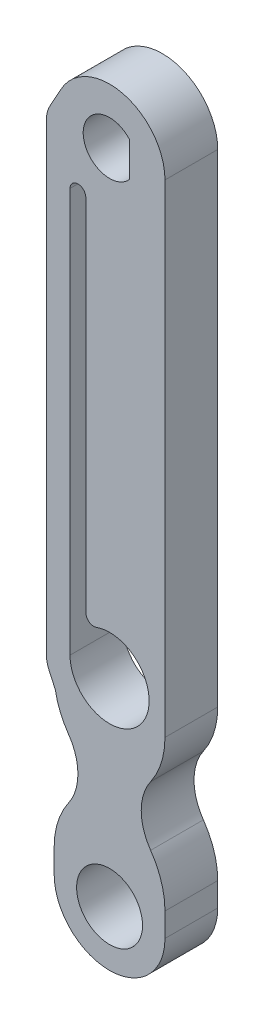
ISO-10303-21;
HEADER;
FILE_DESCRIPTION(('STEP AP214'),'2;1');
FILE_NAME('part.step','',(''),(''),'','','');
FILE_SCHEMA(('AUTOMOTIVE_DESIGN { 1 0 10303 214 1 1 1 1 }'));
ENDSEC;
DATA;
#1=APPLICATION_CONTEXT('core data for automotive mechanical design processes');
#2=APPLICATION_PROTOCOL_DEFINITION('international standard','automotive_design',2000,#1);
#3=PRODUCT_CONTEXT('',#1,'mechanical');
#4=PRODUCT('Part','Part','',(#3));
#5=PRODUCT_RELATED_PRODUCT_CATEGORY('part','',(#4));
#6=PRODUCT_DEFINITION_FORMATION('','',#4);
#7=PRODUCT_DEFINITION_CONTEXT('part definition',#1,'design');
#8=PRODUCT_DEFINITION('design','',#6,#7);
#9=PRODUCT_DEFINITION_SHAPE('','',#8);
#10=(LENGTH_UNIT() NAMED_UNIT(*) SI_UNIT(.MILLI.,.METRE.));
#11=(NAMED_UNIT(*) PLANE_ANGLE_UNIT() SI_UNIT($,.RADIAN.));
#12=(NAMED_UNIT(*) SI_UNIT($,.STERADIAN.) SOLID_ANGLE_UNIT());
#13=UNCERTAINTY_MEASURE_WITH_UNIT(LENGTH_MEASURE(1.E-05),#10,'distance_accuracy_value','');
#14=(GEOMETRIC_REPRESENTATION_CONTEXT(3) GLOBAL_UNCERTAINTY_ASSIGNED_CONTEXT((#13)) GLOBAL_UNIT_ASSIGNED_CONTEXT((#10,
#11,#12)) REPRESENTATION_CONTEXT('',''));
#15=CARTESIAN_POINT('',(0.,0.,0.));
#16=DIRECTION('',(0.,0.,1.));
#17=DIRECTION('',(1.,0.,0.));
#18=AXIS2_PLACEMENT_3D('',#15,#16,#17);
#19=CARTESIAN_POINT('',(0.,49.8,4.));
#20=DIRECTION('',(0.,0.,1.));
#21=DIRECTION('',(1.,0.,0.));
#22=AXIS2_PLACEMENT_3D('',#19,#20,#21);
#23=PLANE('',#22);
#24=CARTESIAN_POINT('',(0.,49.8,4.));
#25=DIRECTION('',(0.,0.,1.));
#26=DIRECTION('',(1.,0.,0.));
#27=AXIS2_PLACEMENT_3D('',#24,#25,#26);
#28=CIRCLE('',#27,4.20000000000001);
#29=CARTESIAN_POINT('',(4.19999999999998,49.8,4.));
#30=VERTEX_POINT('',#29);
#31=CARTESIAN_POINT('',(-3.70531896054092,51.7775265865865,4.));
#32=VERTEX_POINT('',#31);
#33=EDGE_CURVE('E257',#30,#32,#28,.T.);
#34=ORIENTED_EDGE('',*,*,#33,.T.);
#35=DIRECTION('',(-0.484308711135824,-0.874897178140356,0.));
#36=VECTOR('',#35,1.);
#37=CARTESIAN_POINT('',(-3.70531896054092,51.7775265865865,4.));
#38=LINE('',#37,#36);
#39=CARTESIAN_POINT('',(-4.49975322753685,50.3423917594992,4.));
#40=VERTEX_POINT('',#39);
#41=EDGE_CURVE('E260',#32,#40,#38,.T.);
#42=ORIENTED_EDGE('',*,*,#41,.T.);
#43=CARTESIAN_POINT('',(-2.40000000000001,49.1800508527732,4.));
#44=DIRECTION('',(0.,0.,1.));
#45=DIRECTION('',(1.,0.,0.));
#46=AXIS2_PLACEMENT_3D('',#43,#44,#45);
#47=CIRCLE('',#46,2.4);
#48=CARTESIAN_POINT('',(-4.80000000000001,49.1800508527732,4.));
#49=VERTEX_POINT('',#48);
#50=EDGE_CURVE('E263',#40,#49,#47,.T.);
#51=ORIENTED_EDGE('',*,*,#50,.T.);
#52=DIRECTION('',(0.,-1.,0.));
#53=VECTOR('',#52,1.);
#54=CARTESIAN_POINT('',(-4.80000000000001,49.1800508527732,4.));
#55=LINE('',#54,#53);
#56=CARTESIAN_POINT('',(-4.80000000000001,14.2024983221903,4.));
#57=VERTEX_POINT('',#56);
#58=EDGE_CURVE('E265',#49,#57,#55,.T.);
#59=ORIENTED_EDGE('',*,*,#58,.T.);
#60=CARTESIAN_POINT('',(-2.40000000000001,14.2024983221903,4.));
#61=DIRECTION('',(0.,0.,1.));
#62=DIRECTION('',(1.,0.,0.));
#63=AXIS2_PLACEMENT_3D('',#60,#61,#62);
#64=CIRCLE('',#63,2.4);
#65=CARTESIAN_POINT('',(-4.58181817947653,13.2026636199991,4.));
#66=VERTEX_POINT('',#65);
#67=EDGE_CURVE('E267',#57,#66,#64,.T.);
#68=ORIENTED_EDGE('',*,*,#67,.T.);
#69=DIRECTION('',(0.416597792579657,-0.909090908115221,0.));
#70=VECTOR('',#69,1.);
#71=CARTESIAN_POINT('',(-4.58181817947653,13.2026636199991,4.));
#72=LINE('',#71,#70);
#73=CARTESIAN_POINT('',(-4.11235575406724,12.1782126261554,4.));
#74=VERTEX_POINT('',#73);
#75=EDGE_CURVE('E269',#66,#74,#72,.T.);
#76=ORIENTED_EDGE('',*,*,#75,.T.);
#77=CARTESIAN_POINT('',(1.79999999999999,13.2,4.));
#78=DIRECTION('',(0.,0.,1.));
#79=DIRECTION('',(1.,0.,0.));
#80=AXIS2_PLACEMENT_3D('',#77,#78,#79);
#81=CIRCLE('',#80,6.00000000000001);
#82=CARTESIAN_POINT('',(-3.11183879093201,9.75415617128463,4.));
#83=VERTEX_POINT('',#82);
#84=EDGE_CURVE('E271',#74,#83,#81,.T.);
#85=ORIENTED_EDGE('',*,*,#84,.T.);
#86=CARTESIAN_POINT('',(-6.32500000000002,7.49999999999999,4.));
#87=DIRECTION('',(0.,0.,-1.));
#88=DIRECTION('',(1.,0.,0.));
#89=AXIS2_PLACEMENT_3D('',#86,#87,#88);
#90=CIRCLE('',#89,3.925);
#91=CARTESIAN_POINT('',(-3.11183879093201,5.24584382871536,4.));
#92=VERTEX_POINT('',#91);
#93=EDGE_CURVE('E273',#83,#92,#90,.T.);
#94=ORIENTED_EDGE('',*,*,#93,.T.);
#95=CARTESIAN_POINT('',(1.8,1.80000000000002,4.));
#96=DIRECTION('',(0.,0.,1.));
#97=DIRECTION('',(1.,0.,0.));
#98=AXIS2_PLACEMENT_3D('',#95,#96,#97);
#99=CIRCLE('',#98,6.00000000000001);
#100=CARTESIAN_POINT('',(-4.2,1.80000000000004,4.));
#101=VERTEX_POINT('',#100);
#102=EDGE_CURVE('E275',#92,#101,#99,.T.);
#103=ORIENTED_EDGE('',*,*,#102,.T.);
#104=DIRECTION('',(0.,-1.,0.));
#105=VECTOR('',#104,1.);
#106=CARTESIAN_POINT('',(-4.2,1.80000000000004,4.));
#107=LINE('',#106,#105);
#108=CARTESIAN_POINT('',(-4.2,0.,4.));
#109=VERTEX_POINT('',#108);
#110=EDGE_CURVE('E277',#101,#109,#107,.T.);
#111=ORIENTED_EDGE('',*,*,#110,.T.);
#112=CARTESIAN_POINT('',(0.,0.,4.));
#113=DIRECTION('',(0.,0.,1.));
#114=DIRECTION('',(1.,0.,0.));
#115=AXIS2_PLACEMENT_3D('',#112,#113,#114);
#116=CIRCLE('',#115,4.2);
#117=CARTESIAN_POINT('',(4.2,0.,4.));
#118=VERTEX_POINT('',#117);
#119=EDGE_CURVE('E279',#109,#118,#116,.T.);
#120=ORIENTED_EDGE('',*,*,#119,.T.);
#121=DIRECTION('',(0.,1.,0.));
#122=VECTOR('',#121,1.);
#123=CARTESIAN_POINT('',(4.2,0.,4.));
#124=LINE('',#123,#122);
#125=CARTESIAN_POINT('',(4.2,1.80000000000002,4.));
#126=VERTEX_POINT('',#125);
#127=EDGE_CURVE('E281',#118,#126,#124,.T.);
#128=ORIENTED_EDGE('',*,*,#127,.T.);
#129=CARTESIAN_POINT('',(-1.8,1.8,4.));
#130=DIRECTION('',(0.,0.,1.));
#131=DIRECTION('',(1.,0.,0.));
#132=AXIS2_PLACEMENT_3D('',#129,#130,#131);
#133=CIRCLE('',#132,6.00000000000001);
#134=CARTESIAN_POINT('',(3.111838790932,5.24584382871537,4.));
#135=VERTEX_POINT('',#134);
#136=EDGE_CURVE('E283',#126,#135,#133,.T.);
#137=ORIENTED_EDGE('',*,*,#136,.T.);
#138=CARTESIAN_POINT('',(6.32499999999999,7.50000000000002,4.));
#139=DIRECTION('',(0.,0.,-1.));
#140=DIRECTION('',(1.,0.,0.));
#141=AXIS2_PLACEMENT_3D('',#138,#139,#140);
#142=CIRCLE('',#141,3.925);
#143=CARTESIAN_POINT('',(3.11183879093197,9.75415617128464,4.));
#144=VERTEX_POINT('',#143);
#145=EDGE_CURVE('E285',#135,#144,#142,.T.);
#146=ORIENTED_EDGE('',*,*,#145,.T.);
#147=CARTESIAN_POINT('',(-1.80000000000003,13.2,4.));
#148=DIRECTION('',(0.,0.,1.));
#149=DIRECTION('',(1.,0.,0.));
#150=AXIS2_PLACEMENT_3D('',#147,#148,#149);
#151=CIRCLE('',#150,6.00000000000001);
#152=CARTESIAN_POINT('',(4.19999999999998,13.2,4.));
#153=VERTEX_POINT('',#152);
#154=EDGE_CURVE('E287',#144,#153,#151,.T.);
#155=ORIENTED_EDGE('',*,*,#154,.T.);
#156=DIRECTION('',(0.,1.,0.));
#157=VECTOR('',#156,1.);
#158=CARTESIAN_POINT('',(4.19999999999998,13.2,4.));
#159=LINE('',#158,#157);
#160=EDGE_CURVE('E289',#153,#30,#159,.T.);
#161=ORIENTED_EDGE('',*,*,#160,.T.);
#162=EDGE_LOOP('',(#34,#42,#51,#59,#68,#76,#85,#94,#103,#111,#120,#128,#137,#146,#155,#161));
#163=FACE_BOUND('',#162,.T.);
#164=CARTESIAN_POINT('',(0.,0.,4.));
#165=DIRECTION('',(0.,0.,1.));
#166=DIRECTION('',(1.,0.,0.));
#167=AXIS2_PLACEMENT_3D('',#164,#165,#166);
#168=CIRCLE('',#167,2.5);
#169=CARTESIAN_POINT('',(2.5,0.,4.));
#170=VERTEX_POINT('',#169);
#171=EDGE_CURVE('E251',#170,#170,#168,.T.);
#172=ORIENTED_EDGE('',*,*,#171,.F.);
#173=EDGE_LOOP('',(#172));
#174=FACE_BOUND('',#173,.T.);
#175=DIRECTION('',(0.,1.,0.));
#176=VECTOR('',#175,1.);
#177=CARTESIAN_POINT('',(1.49999999999999,48.4771243444677,4.));
#178=LINE('',#177,#176);
#179=CARTESIAN_POINT('',(1.49999999999999,48.4771243444677,4.));
#180=VERTEX_POINT('',#179);
#181=CARTESIAN_POINT('',(1.5,51.1228756555323,4.));
#182=VERTEX_POINT('',#181);
#183=EDGE_CURVE('E237',#180,#182,#178,.T.);
#184=ORIENTED_EDGE('',*,*,#183,.F.);
#185=CARTESIAN_POINT('',(0.,49.8,4.));
#186=DIRECTION('',(0.,0.,1.));
#187=DIRECTION('',(1.,0.,0.));
#188=AXIS2_PLACEMENT_3D('',#185,#186,#187);
#189=CIRCLE('',#188,2.);
#190=EDGE_CURVE('E234',#182,#180,#189,.T.);
#191=ORIENTED_EDGE('',*,*,#190,.F.);
#192=EDGE_LOOP('',(#184,#191));
#193=FACE_BOUND('',#192,.T.);
#194=CARTESIAN_POINT('',(-1.20000000000001,18.3941125496954,4.));
#195=DIRECTION('',(0.,0.,-1.));
#196=DIRECTION('',(1.,0.,0.));
#197=AXIS2_PLACEMENT_3D('',#194,#195,#196);
#198=CIRCLE('',#197,0.599999999999997);
#199=CARTESIAN_POINT('',(-0.99999999999999,17.8284271247462,4.));
#200=VERTEX_POINT('',#199);
#201=CARTESIAN_POINT('',(-1.80000000000001,18.3941125496955,4.));
#202=VERTEX_POINT('',#201);
#203=EDGE_CURVE('E198',#200,#202,#198,.T.);
#204=ORIENTED_EDGE('',*,*,#203,.F.);
#205=CARTESIAN_POINT('',(0.,15.,4.));
#206=DIRECTION('',(0.,0.,1.));
#207=DIRECTION('',(1.,0.,0.));
#208=AXIS2_PLACEMENT_3D('',#205,#206,#207);
#209=CIRCLE('',#208,3.00000000000001);
#210=CARTESIAN_POINT('',(-3.00000000000001,15.,4.));
#211=VERTEX_POINT('',#210);
#212=EDGE_CURVE('E190',#211,#200,#209,.T.);
#213=ORIENTED_EDGE('',*,*,#212,.F.);
#214=DIRECTION('',(0.,-1.,0.));
#215=VECTOR('',#214,1.);
#216=CARTESIAN_POINT('',(-3.00000000000001,45.6430780618347,4.));
#217=LINE('',#216,#215);
#218=CARTESIAN_POINT('',(-3.00000000000001,45.6430780618347,4.));
#219=VERTEX_POINT('',#218);
#220=EDGE_CURVE('E217',#219,#211,#217,.T.);
#221=ORIENTED_EDGE('',*,*,#220,.F.);
#222=CARTESIAN_POINT('',(-2.40000000000001,45.6430780618347,4.));
#223=DIRECTION('',(0.,0.,1.));
#224=DIRECTION('',(1.,0.,0.));
#225=AXIS2_PLACEMENT_3D('',#222,#223,#224);
#226=CIRCLE('',#225,0.600000000000001);
#227=CARTESIAN_POINT('',(-1.80000000000001,45.6430780618347,4.));
#228=VERTEX_POINT('',#227);
#229=EDGE_CURVE('E213',#228,#219,#226,.T.);
#230=ORIENTED_EDGE('',*,*,#229,.F.);
#231=DIRECTION('',(0.,1.,0.));
#232=VECTOR('',#231,1.);
#233=CARTESIAN_POINT('',(-1.80000000000001,18.3941125496955,4.));
#234=LINE('',#233,#232);
#235=EDGE_CURVE('E211',#202,#228,#234,.T.);
#236=ORIENTED_EDGE('',*,*,#235,.F.);
#237=EDGE_LOOP('',(#204,#213,#221,#230,#236));
#238=FACE_BOUND('',#237,.T.);
#239=ADVANCED_FACE('F35',(#163,#174,#193,#238),#23,.T.);
#240=CARTESIAN_POINT('',(0.,49.8,0.));
#241=DIRECTION('',(0.,0.,1.));
#242=DIRECTION('',(1.,0.,0.));
#243=AXIS2_PLACEMENT_3D('',#240,#241,#242);
#244=PLANE('',#243);
#245=CARTESIAN_POINT('',(0.,49.8,0.));
#246=DIRECTION('',(0.,0.,1.));
#247=DIRECTION('',(1.,0.,0.));
#248=AXIS2_PLACEMENT_3D('',#245,#246,#247);
#249=CIRCLE('',#248,2.);
#250=CARTESIAN_POINT('',(1.5,51.1228756555323,0.));
#251=VERTEX_POINT('',#250);
#252=CARTESIAN_POINT('',(1.49999999999999,48.4771243444677,0.));
#253=VERTEX_POINT('',#252);
#254=EDGE_CURVE('E206',#251,#253,#249,.T.);
#255=ORIENTED_EDGE('',*,*,#254,.T.);
#256=DIRECTION('',(0.,1.,0.));
#257=VECTOR('',#256,1.);
#258=CARTESIAN_POINT('',(1.49999999999999,48.4771243444677,0.));
#259=LINE('',#258,#257);
#260=EDGE_CURVE('E238',#253,#251,#259,.T.);
#261=ORIENTED_EDGE('',*,*,#260,.T.);
#262=EDGE_LOOP('',(#255,#261));
#263=FACE_BOUND('',#262,.T.);
#264=CARTESIAN_POINT('',(0.,49.8,0.));
#265=DIRECTION('',(0.,0.,1.));
#266=DIRECTION('',(1.,0.,0.));
#267=AXIS2_PLACEMENT_3D('',#264,#265,#266);
#268=CIRCLE('',#267,4.20000000000001);
#269=CARTESIAN_POINT('',(4.19999999999998,49.8,0.));
#270=VERTEX_POINT('',#269);
#271=CARTESIAN_POINT('',(-3.70531896054092,51.7775265865865,0.));
#272=VERTEX_POINT('',#271);
#273=EDGE_CURVE('E254',#270,#272,#268,.T.);
#274=ORIENTED_EDGE('',*,*,#273,.F.);
#275=DIRECTION('',(0.,1.,0.));
#276=VECTOR('',#275,1.);
#277=CARTESIAN_POINT('',(4.19999999999998,13.2,0.));
#278=LINE('',#277,#276);
#279=CARTESIAN_POINT('',(4.19999999999998,13.2,0.));
#280=VERTEX_POINT('',#279);
#281=EDGE_CURVE('E261',#280,#270,#278,.T.);
#282=ORIENTED_EDGE('',*,*,#281,.F.);
#283=CARTESIAN_POINT('',(-1.80000000000003,13.2,0.));
#284=DIRECTION('',(0.,0.,1.));
#285=DIRECTION('',(1.,0.,0.));
#286=AXIS2_PLACEMENT_3D('',#283,#284,#285);
#287=CIRCLE('',#286,6.00000000000001);
#288=CARTESIAN_POINT('',(3.11183879093197,9.75415617128464,0.));
#289=VERTEX_POINT('',#288);
#290=EDGE_CURVE('E320',#289,#280,#287,.T.);
#291=ORIENTED_EDGE('',*,*,#290,.F.);
#292=CARTESIAN_POINT('',(6.32499999999999,7.50000000000002,0.));
#293=DIRECTION('',(0.,0.,-1.));
#294=DIRECTION('',(1.,0.,0.));
#295=AXIS2_PLACEMENT_3D('',#292,#293,#294);
#296=CIRCLE('',#295,3.925);
#297=CARTESIAN_POINT('',(3.111838790932,5.24584382871537,0.));
#298=VERTEX_POINT('',#297);
#299=EDGE_CURVE('E318',#298,#289,#296,.T.);
#300=ORIENTED_EDGE('',*,*,#299,.F.);
#301=CARTESIAN_POINT('',(-1.8,1.8,0.));
#302=DIRECTION('',(0.,0.,1.));
#303=DIRECTION('',(1.,0.,0.));
#304=AXIS2_PLACEMENT_3D('',#301,#302,#303);
#305=CIRCLE('',#304,6.00000000000001);
#306=CARTESIAN_POINT('',(4.2,1.80000000000002,0.));
#307=VERTEX_POINT('',#306);
#308=EDGE_CURVE('E316',#307,#298,#305,.T.);
#309=ORIENTED_EDGE('',*,*,#308,.F.);
#310=DIRECTION('',(0.,1.,0.));
#311=VECTOR('',#310,1.);
#312=CARTESIAN_POINT('',(4.2,0.,0.));
#313=LINE('',#312,#311);
#314=CARTESIAN_POINT('',(4.2,0.,0.));
#315=VERTEX_POINT('',#314);
#316=EDGE_CURVE('E314',#315,#307,#313,.T.);
#317=ORIENTED_EDGE('',*,*,#316,.F.);
#318=CARTESIAN_POINT('',(0.,0.,0.));
#319=DIRECTION('',(0.,0.,1.));
#320=DIRECTION('',(1.,0.,0.));
#321=AXIS2_PLACEMENT_3D('',#318,#319,#320);
#322=CIRCLE('',#321,4.2);
#323=CARTESIAN_POINT('',(-4.2,0.,0.));
#324=VERTEX_POINT('',#323);
#325=EDGE_CURVE('E312',#324,#315,#322,.T.);
#326=ORIENTED_EDGE('',*,*,#325,.F.);
#327=DIRECTION('',(0.,-1.,0.));
#328=VECTOR('',#327,1.);
#329=CARTESIAN_POINT('',(-4.2,1.80000000000004,0.));
#330=LINE('',#329,#328);
#331=CARTESIAN_POINT('',(-4.2,1.80000000000004,0.));
#332=VERTEX_POINT('',#331);
#333=EDGE_CURVE('E310',#332,#324,#330,.T.);
#334=ORIENTED_EDGE('',*,*,#333,.F.);
#335=CARTESIAN_POINT('',(1.8,1.80000000000002,0.));
#336=DIRECTION('',(0.,0.,1.));
#337=DIRECTION('',(1.,0.,0.));
#338=AXIS2_PLACEMENT_3D('',#335,#336,#337);
#339=CIRCLE('',#338,6.00000000000001);
#340=CARTESIAN_POINT('',(-3.11183879093201,5.24584382871536,0.));
#341=VERTEX_POINT('',#340);
#342=EDGE_CURVE('E308',#341,#332,#339,.T.);
#343=ORIENTED_EDGE('',*,*,#342,.F.);
#344=CARTESIAN_POINT('',(-6.32500000000002,7.49999999999999,0.));
#345=DIRECTION('',(0.,0.,-1.));
#346=DIRECTION('',(1.,0.,0.));
#347=AXIS2_PLACEMENT_3D('',#344,#345,#346);
#348=CIRCLE('',#347,3.925);
#349=CARTESIAN_POINT('',(-3.11183879093201,9.75415617128463,0.));
#350=VERTEX_POINT('',#349);
#351=EDGE_CURVE('E306',#350,#341,#348,.T.);
#352=ORIENTED_EDGE('',*,*,#351,.F.);
#353=CARTESIAN_POINT('',(1.79999999999999,13.2,0.));
#354=DIRECTION('',(0.,0.,1.));
#355=DIRECTION('',(1.,0.,0.));
#356=AXIS2_PLACEMENT_3D('',#353,#354,#355);
#357=CIRCLE('',#356,6.00000000000001);
#358=CARTESIAN_POINT('',(-4.11235575406724,12.1782126261554,0.));
#359=VERTEX_POINT('',#358);
#360=EDGE_CURVE('E304',#359,#350,#357,.T.);
#361=ORIENTED_EDGE('',*,*,#360,.F.);
#362=DIRECTION('',(0.416597792579657,-0.909090908115221,0.));
#363=VECTOR('',#362,1.);
#364=CARTESIAN_POINT('',(-4.58181817947653,13.2026636199991,0.));
#365=LINE('',#364,#363);
#366=CARTESIAN_POINT('',(-4.58181817947653,13.2026636199991,0.));
#367=VERTEX_POINT('',#366);
#368=EDGE_CURVE('E302',#367,#359,#365,.T.);
#369=ORIENTED_EDGE('',*,*,#368,.F.);
#370=CARTESIAN_POINT('',(-2.40000000000001,14.2024983221903,0.));
#371=DIRECTION('',(0.,0.,1.));
#372=DIRECTION('',(1.,0.,0.));
#373=AXIS2_PLACEMENT_3D('',#370,#371,#372);
#374=CIRCLE('',#373,2.4);
#375=CARTESIAN_POINT('',(-4.80000000000001,14.2024983221903,0.));
#376=VERTEX_POINT('',#375);
#377=EDGE_CURVE('E300',#376,#367,#374,.T.);
#378=ORIENTED_EDGE('',*,*,#377,.F.);
#379=DIRECTION('',(0.,-1.,0.));
#380=VECTOR('',#379,1.);
#381=CARTESIAN_POINT('',(-4.80000000000001,49.1800508527732,0.));
#382=LINE('',#381,#380);
#383=CARTESIAN_POINT('',(-4.80000000000001,49.1800508527732,0.));
#384=VERTEX_POINT('',#383);
#385=EDGE_CURVE('E298',#384,#376,#382,.T.);
#386=ORIENTED_EDGE('',*,*,#385,.F.);
#387=CARTESIAN_POINT('',(-2.40000000000001,49.1800508527732,0.));
#388=DIRECTION('',(0.,0.,1.));
#389=DIRECTION('',(1.,0.,0.));
#390=AXIS2_PLACEMENT_3D('',#387,#388,#389);
#391=CIRCLE('',#390,2.4);
#392=CARTESIAN_POINT('',(-4.49975322753685,50.3423917594992,0.));
#393=VERTEX_POINT('',#392);
#394=EDGE_CURVE('E296',#393,#384,#391,.T.);
#395=ORIENTED_EDGE('',*,*,#394,.F.);
#396=DIRECTION('',(-0.484308711135824,-0.874897178140356,0.));
#397=VECTOR('',#396,1.);
#398=CARTESIAN_POINT('',(-3.70531896054092,51.7775265865865,0.));
#399=LINE('',#398,#397);
#400=EDGE_CURVE('E294',#272,#393,#399,.T.);
#401=ORIENTED_EDGE('',*,*,#400,.F.);
#402=EDGE_LOOP('',(#274,#282,#291,#300,#309,#317,#326,#334,#343,#352,#361,#369,#378,#386,#395,#401));
#403=FACE_BOUND('',#402,.T.);
#404=CARTESIAN_POINT('',(0.,0.,0.));
#405=DIRECTION('',(0.,0.,1.));
#406=DIRECTION('',(1.,0.,0.));
#407=AXIS2_PLACEMENT_3D('',#404,#405,#406);
#408=CIRCLE('',#407,2.5);
#409=CARTESIAN_POINT('',(2.5,0.,0.));
#410=VERTEX_POINT('',#409);
#411=EDGE_CURVE('E250',#410,#410,#408,.T.);
#412=ORIENTED_EDGE('',*,*,#411,.T.);
#413=EDGE_LOOP('',(#412));
#414=FACE_BOUND('',#413,.T.);
#415=CARTESIAN_POINT('',(0.,15.,0.));
#416=DIRECTION('',(0.,0.,1.));
#417=DIRECTION('',(1.,0.,0.));
#418=AXIS2_PLACEMENT_3D('',#415,#416,#417);
#419=CIRCLE('',#418,3.00000000000001);
#420=CARTESIAN_POINT('',(-3.00000000000001,15.,0.));
#421=VERTEX_POINT('',#420);
#422=CARTESIAN_POINT('',(-0.99999999999999,17.8284271247462,0.));
#423=VERTEX_POINT('',#422);
#424=EDGE_CURVE('E58',#421,#423,#419,.T.);
#425=ORIENTED_EDGE('',*,*,#424,.T.);
#426=CARTESIAN_POINT('',(-1.20000000000001,18.3941125496954,0.));
#427=DIRECTION('',(0.,0.,-1.));
#428=DIRECTION('',(1.,0.,0.));
#429=AXIS2_PLACEMENT_3D('',#426,#427,#428);
#430=CIRCLE('',#429,0.599999999999997);
#431=CARTESIAN_POINT('',(-1.80000000000001,18.3941125496955,0.));
#432=VERTEX_POINT('',#431);
#433=EDGE_CURVE('E205',#423,#432,#430,.T.);
#434=ORIENTED_EDGE('',*,*,#433,.T.);
#435=DIRECTION('',(0.,1.,0.));
#436=VECTOR('',#435,1.);
#437=CARTESIAN_POINT('',(-1.80000000000001,18.3941125496955,0.));
#438=LINE('',#437,#436);
#439=CARTESIAN_POINT('',(-1.80000000000001,45.6430780618347,0.));
#440=VERTEX_POINT('',#439);
#441=EDGE_CURVE('E221',#432,#440,#438,.T.);
#442=ORIENTED_EDGE('',*,*,#441,.T.);
#443=CARTESIAN_POINT('',(-2.40000000000001,45.6430780618347,0.));
#444=DIRECTION('',(0.,0.,1.));
#445=DIRECTION('',(1.,0.,0.));
#446=AXIS2_PLACEMENT_3D('',#443,#444,#445);
#447=CIRCLE('',#446,0.600000000000001);
#448=CARTESIAN_POINT('',(-3.00000000000001,45.6430780618347,0.));
#449=VERTEX_POINT('',#448);
#450=EDGE_CURVE('E224',#440,#449,#447,.T.);
#451=ORIENTED_EDGE('',*,*,#450,.T.);
#452=DIRECTION('',(0.,-1.,0.));
#453=VECTOR('',#452,1.);
#454=CARTESIAN_POINT('',(-3.00000000000001,45.6430780618347,0.));
#455=LINE('',#454,#453);
#456=EDGE_CURVE('E199',#449,#421,#455,.T.);
#457=ORIENTED_EDGE('',*,*,#456,.T.);
#458=EDGE_LOOP('',(#425,#434,#442,#451,#457));
#459=FACE_BOUND('',#458,.T.);
#460=ADVANCED_FACE('F374',(#263,#403,#414,#459),#244,.F.);
#461=CARTESIAN_POINT('',(0.,49.8,4.));
#462=DIRECTION('',(0.,0.,-1.));
#463=DIRECTION('',(-1.,0.,0.));
#464=AXIS2_PLACEMENT_3D('',#461,#462,#463);
#465=CYLINDRICAL_SURFACE('',#464,4.20000000000001);
#466=ORIENTED_EDGE('',*,*,#273,.T.);
#467=DIRECTION('',(0.,0.,-1.));
#468=VECTOR('',#467,1.);
#469=CARTESIAN_POINT('',(-3.70531896054092,51.7775265865865,4.));
#470=LINE('',#469,#468);
#471=EDGE_CURVE('E11',#32,#272,#470,.T.);
#472=ORIENTED_EDGE('',*,*,#471,.F.);
#473=ORIENTED_EDGE('',*,*,#33,.F.);
#474=DIRECTION('',(0.,0.,-1.));
#475=VECTOR('',#474,1.);
#476=CARTESIAN_POINT('',(4.19999999999998,49.8,4.));
#477=LINE('',#476,#475);
#478=EDGE_CURVE('E291',#30,#270,#477,.T.);
#479=ORIENTED_EDGE('',*,*,#478,.T.);
#480=EDGE_LOOP('',(#466,#472,#473,#479));
#481=FACE_BOUND('',#480,.T.);
#482=ADVANCED_FACE('F37',(#481),#465,.T.);
#483=CARTESIAN_POINT('',(-3.70531896054092,51.7775265865865,4.));
#484=DIRECTION('',(0.874897178140356,-0.484308711135824,0.));
#485=DIRECTION('',(0.484308711135824,0.874897178140356,0.));
#486=AXIS2_PLACEMENT_3D('',#483,#484,#485);
#487=PLANE('',#486);
#488=ORIENTED_EDGE('',*,*,#400,.T.);
#489=DIRECTION('',(0.,0.,-1.));
#490=VECTOR('',#489,1.);
#491=CARTESIAN_POINT('',(-4.49975322753685,50.3423917594992,4.));
#492=LINE('',#491,#490);
#493=EDGE_CURVE('E43',#40,#393,#492,.T.);
#494=ORIENTED_EDGE('',*,*,#493,.F.);
#495=ORIENTED_EDGE('',*,*,#41,.F.);
#496=ORIENTED_EDGE('',*,*,#471,.T.);
#497=EDGE_LOOP('',(#488,#494,#495,#496));
#498=FACE_BOUND('',#497,.T.);
#499=ADVANCED_FACE('F392',(#498),#487,.F.);
#500=CARTESIAN_POINT('',(-2.40000000000001,49.1800508527732,4.));
#501=DIRECTION('',(0.,0.,-1.));
#502=DIRECTION('',(-1.,0.,0.));
#503=AXIS2_PLACEMENT_3D('',#500,#501,#502);
#504=CYLINDRICAL_SURFACE('',#503,2.4);
#505=ORIENTED_EDGE('',*,*,#394,.T.);
#506=DIRECTION('',(0.,0.,-1.));
#507=VECTOR('',#506,1.);
#508=CARTESIAN_POINT('',(-4.80000000000001,49.1800508527732,4.));
#509=LINE('',#508,#507);
#510=EDGE_CURVE('E361',#49,#384,#509,.T.);
#511=ORIENTED_EDGE('',*,*,#510,.F.);
#512=ORIENTED_EDGE('',*,*,#50,.F.);
#513=ORIENTED_EDGE('',*,*,#493,.T.);
#514=EDGE_LOOP('',(#505,#511,#512,#513));
#515=FACE_BOUND('',#514,.T.);
#516=ADVANCED_FACE('F368',(#515),#504,.T.);
#517=CARTESIAN_POINT('',(-4.80000000000001,49.1800508527732,4.));
#518=DIRECTION('',(1.,0.,0.));
#519=DIRECTION('',(0.,0.,-1.));
#520=AXIS2_PLACEMENT_3D('',#517,#518,#519);
#521=PLANE('',#520);
#522=ORIENTED_EDGE('',*,*,#385,.T.);
#523=DIRECTION('',(0.,0.,-1.));
#524=VECTOR('',#523,1.);
#525=CARTESIAN_POINT('',(-4.80000000000001,14.2024983221903,4.));
#526=LINE('',#525,#524);
#527=EDGE_CURVE('E358',#57,#376,#526,.T.);
#528=ORIENTED_EDGE('',*,*,#527,.F.);
#529=ORIENTED_EDGE('',*,*,#58,.F.);
#530=ORIENTED_EDGE('',*,*,#510,.T.);
#531=EDGE_LOOP('',(#522,#528,#529,#530));
#532=FACE_BOUND('',#531,.T.);
#533=ADVANCED_FACE('F380',(#532),#521,.F.);
#534=CARTESIAN_POINT('',(-2.40000000000001,14.2024983221903,4.));
#535=DIRECTION('',(0.,0.,-1.));
#536=DIRECTION('',(-1.,0.,0.));
#537=AXIS2_PLACEMENT_3D('',#534,#535,#536);
#538=CYLINDRICAL_SURFACE('',#537,2.4);
#539=ORIENTED_EDGE('',*,*,#377,.T.);
#540=DIRECTION('',(0.,0.,-1.));
#541=VECTOR('',#540,1.);
#542=CARTESIAN_POINT('',(-4.58181817947653,13.2026636199991,4.));
#543=LINE('',#542,#541);
#544=EDGE_CURVE('E355',#66,#367,#543,.T.);
#545=ORIENTED_EDGE('',*,*,#544,.F.);
#546=ORIENTED_EDGE('',*,*,#67,.F.);
#547=ORIENTED_EDGE('',*,*,#527,.T.);
#548=EDGE_LOOP('',(#539,#545,#546,#547));
#549=FACE_BOUND('',#548,.T.);
#550=ADVANCED_FACE('F384',(#549),#538,.T.);
#551=CARTESIAN_POINT('',(-4.58181817947653,13.2026636199991,4.));
#552=DIRECTION('',(0.909090908115221,0.416597792579657,0.));
#553=DIRECTION('',(-0.416597792579657,0.909090908115221,0.));
#554=AXIS2_PLACEMENT_3D('',#551,#552,#553);
#555=PLANE('',#554);
#556=ORIENTED_EDGE('',*,*,#368,.T.);
#557=DIRECTION('',(0.,0.,-1.));
#558=VECTOR('',#557,1.);
#559=CARTESIAN_POINT('',(-4.11235575406724,12.1782126261554,4.));
#560=LINE('',#559,#558);
#561=EDGE_CURVE('E352',#74,#359,#560,.T.);
#562=ORIENTED_EDGE('',*,*,#561,.F.);
#563=ORIENTED_EDGE('',*,*,#75,.F.);
#564=ORIENTED_EDGE('',*,*,#544,.T.);
#565=EDGE_LOOP('',(#556,#562,#563,#564));
#566=FACE_BOUND('',#565,.T.);
#567=ADVANCED_FACE('F445',(#566),#555,.F.);
#568=CARTESIAN_POINT('',(1.79999999999999,13.2,4.));
#569=DIRECTION('',(0.,0.,-1.));
#570=DIRECTION('',(-1.,0.,0.));
#571=AXIS2_PLACEMENT_3D('',#568,#569,#570);
#572=CYLINDRICAL_SURFACE('',#571,6.00000000000001);
#573=ORIENTED_EDGE('',*,*,#360,.T.);
#574=DIRECTION('',(0.,0.,-1.));
#575=VECTOR('',#574,1.);
#576=CARTESIAN_POINT('',(-3.11183879093201,9.75415617128463,4.));
#577=LINE('',#576,#575);
#578=EDGE_CURVE('E349',#83,#350,#577,.T.);
#579=ORIENTED_EDGE('',*,*,#578,.F.);
#580=ORIENTED_EDGE('',*,*,#84,.F.);
#581=ORIENTED_EDGE('',*,*,#561,.T.);
#582=EDGE_LOOP('',(#573,#579,#580,#581));
#583=FACE_BOUND('',#582,.T.);
#584=ADVANCED_FACE('F442',(#583),#572,.T.);
#585=CARTESIAN_POINT('',(-6.32500000000002,7.49999999999999,4.));
#586=DIRECTION('',(0.,0.,-1.));
#587=DIRECTION('',(-1.,0.,0.));
#588=AXIS2_PLACEMENT_3D('',#585,#586,#587);
#589=CYLINDRICAL_SURFACE('',#588,3.925);
#590=ORIENTED_EDGE('',*,*,#351,.T.);
#591=DIRECTION('',(0.,0.,-1.));
#592=VECTOR('',#591,1.);
#593=CARTESIAN_POINT('',(-3.11183879093201,5.24584382871536,4.));
#594=LINE('',#593,#592);
#595=EDGE_CURVE('E346',#92,#341,#594,.T.);
#596=ORIENTED_EDGE('',*,*,#595,.F.);
#597=ORIENTED_EDGE('',*,*,#93,.F.);
#598=ORIENTED_EDGE('',*,*,#578,.T.);
#599=EDGE_LOOP('',(#590,#596,#597,#598));
#600=FACE_BOUND('',#599,.T.);
#601=ADVANCED_FACE('F438',(#600),#589,.F.);
#602=CARTESIAN_POINT('',(1.8,1.80000000000002,4.));
#603=DIRECTION('',(0.,0.,-1.));
#604=DIRECTION('',(-1.,0.,0.));
#605=AXIS2_PLACEMENT_3D('',#602,#603,#604);
#606=CYLINDRICAL_SURFACE('',#605,6.00000000000001);
#607=ORIENTED_EDGE('',*,*,#342,.T.);
#608=DIRECTION('',(0.,0.,-1.));
#609=VECTOR('',#608,1.);
#610=CARTESIAN_POINT('',(-4.2,1.80000000000004,4.));
#611=LINE('',#610,#609);
#612=EDGE_CURVE('E343',#101,#332,#611,.T.);
#613=ORIENTED_EDGE('',*,*,#612,.F.);
#614=ORIENTED_EDGE('',*,*,#102,.F.);
#615=ORIENTED_EDGE('',*,*,#595,.T.);
#616=EDGE_LOOP('',(#607,#613,#614,#615));
#617=FACE_BOUND('',#616,.T.);
#618=ADVANCED_FACE('F434',(#617),#606,.T.);
#619=CARTESIAN_POINT('',(-4.2,1.80000000000004,4.));
#620=DIRECTION('',(1.,0.,0.));
#621=DIRECTION('',(0.,0.,-1.));
#622=AXIS2_PLACEMENT_3D('',#619,#620,#621);
#623=PLANE('',#622);
#624=ORIENTED_EDGE('',*,*,#333,.T.);
#625=DIRECTION('',(0.,0.,-1.));
#626=VECTOR('',#625,1.);
#627=CARTESIAN_POINT('',(-4.2,0.,4.));
#628=LINE('',#627,#626);
#629=EDGE_CURVE('E340',#109,#324,#628,.T.);
#630=ORIENTED_EDGE('',*,*,#629,.F.);
#631=ORIENTED_EDGE('',*,*,#110,.F.);
#632=ORIENTED_EDGE('',*,*,#612,.T.);
#633=EDGE_LOOP('',(#624,#630,#631,#632));
#634=FACE_BOUND('',#633,.T.);
#635=ADVANCED_FACE('F429',(#634),#623,.F.);
#636=CARTESIAN_POINT('',(0.,0.,4.));
#637=DIRECTION('',(0.,0.,-1.));
#638=DIRECTION('',(-1.,0.,0.));
#639=AXIS2_PLACEMENT_3D('',#636,#637,#638);
#640=CYLINDRICAL_SURFACE('',#639,4.2);
#641=ORIENTED_EDGE('',*,*,#325,.T.);
#642=DIRECTION('',(0.,0.,-1.));
#643=VECTOR('',#642,1.);
#644=CARTESIAN_POINT('',(4.2,0.,4.));
#645=LINE('',#644,#643);
#646=EDGE_CURVE('E337',#118,#315,#645,.T.);
#647=ORIENTED_EDGE('',*,*,#646,.F.);
#648=ORIENTED_EDGE('',*,*,#119,.F.);
#649=ORIENTED_EDGE('',*,*,#629,.T.);
#650=EDGE_LOOP('',(#641,#647,#648,#649));
#651=FACE_BOUND('',#650,.T.);
#652=ADVANCED_FACE('F423',(#651),#640,.T.);
#653=CARTESIAN_POINT('',(4.2,0.,4.));
#654=DIRECTION('',(-1.,0.,0.));
#655=DIRECTION('',(0.,0.,1.));
#656=AXIS2_PLACEMENT_3D('',#653,#654,#655);
#657=PLANE('',#656);
#658=ORIENTED_EDGE('',*,*,#316,.T.);
#659=DIRECTION('',(0.,0.,-1.));
#660=VECTOR('',#659,1.);
#661=CARTESIAN_POINT('',(4.2,1.80000000000002,4.));
#662=LINE('',#661,#660);
#663=EDGE_CURVE('E334',#126,#307,#662,.T.);
#664=ORIENTED_EDGE('',*,*,#663,.F.);
#665=ORIENTED_EDGE('',*,*,#127,.F.);
#666=ORIENTED_EDGE('',*,*,#646,.T.);
#667=EDGE_LOOP('',(#658,#664,#665,#666));
#668=FACE_BOUND('',#667,.T.);
#669=ADVANCED_FACE('F419',(#668),#657,.F.);
#670=CARTESIAN_POINT('',(-1.8,1.8,4.));
#671=DIRECTION('',(0.,0.,-1.));
#672=DIRECTION('',(-1.,0.,0.));
#673=AXIS2_PLACEMENT_3D('',#670,#671,#672);
#674=CYLINDRICAL_SURFACE('',#673,6.00000000000001);
#675=ORIENTED_EDGE('',*,*,#308,.T.);
#676=DIRECTION('',(0.,0.,-1.));
#677=VECTOR('',#676,1.);
#678=CARTESIAN_POINT('',(3.111838790932,5.24584382871537,4.));
#679=LINE('',#678,#677);
#680=EDGE_CURVE('E331',#135,#298,#679,.T.);
#681=ORIENTED_EDGE('',*,*,#680,.F.);
#682=ORIENTED_EDGE('',*,*,#136,.F.);
#683=ORIENTED_EDGE('',*,*,#663,.T.);
#684=EDGE_LOOP('',(#675,#681,#682,#683));
#685=FACE_BOUND('',#684,.T.);
#686=ADVANCED_FACE('F414',(#685),#674,.T.);
#687=CARTESIAN_POINT('',(6.32499999999999,7.50000000000002,4.));
#688=DIRECTION('',(0.,0.,-1.));
#689=DIRECTION('',(-1.,0.,0.));
#690=AXIS2_PLACEMENT_3D('',#687,#688,#689);
#691=CYLINDRICAL_SURFACE('',#690,3.925);
#692=ORIENTED_EDGE('',*,*,#299,.T.);
#693=DIRECTION('',(0.,0.,-1.));
#694=VECTOR('',#693,1.);
#695=CARTESIAN_POINT('',(3.11183879093197,9.75415617128464,4.));
#696=LINE('',#695,#694);
#697=EDGE_CURVE('E328',#144,#289,#696,.T.);
#698=ORIENTED_EDGE('',*,*,#697,.F.);
#699=ORIENTED_EDGE('',*,*,#145,.F.);
#700=ORIENTED_EDGE('',*,*,#680,.T.);
#701=EDGE_LOOP('',(#692,#698,#699,#700));
#702=FACE_BOUND('',#701,.T.);
#703=ADVANCED_FACE('F408',(#702),#691,.F.);
#704=CARTESIAN_POINT('',(-1.80000000000003,13.2,4.));
#705=DIRECTION('',(0.,0.,-1.));
#706=DIRECTION('',(-1.,0.,0.));
#707=AXIS2_PLACEMENT_3D('',#704,#705,#706);
#708=CYLINDRICAL_SURFACE('',#707,6.00000000000001);
#709=ORIENTED_EDGE('',*,*,#290,.T.);
#710=DIRECTION('',(0.,0.,-1.));
#711=VECTOR('',#710,1.);
#712=CARTESIAN_POINT('',(4.19999999999998,13.2,4.));
#713=LINE('',#712,#711);
#714=EDGE_CURVE('E325',#153,#280,#713,.T.);
#715=ORIENTED_EDGE('',*,*,#714,.F.);
#716=ORIENTED_EDGE('',*,*,#154,.F.);
#717=ORIENTED_EDGE('',*,*,#697,.T.);
#718=EDGE_LOOP('',(#709,#715,#716,#717));
#719=FACE_BOUND('',#718,.T.);
#720=ADVANCED_FACE('F404',(#719),#708,.T.);
#721=CARTESIAN_POINT('',(4.19999999999998,13.2,4.));
#722=DIRECTION('',(-1.,0.,0.));
#723=DIRECTION('',(0.,0.,1.));
#724=AXIS2_PLACEMENT_3D('',#721,#722,#723);
#725=PLANE('',#724);
#726=ORIENTED_EDGE('',*,*,#281,.T.);
#727=ORIENTED_EDGE('',*,*,#478,.F.);
#728=ORIENTED_EDGE('',*,*,#160,.F.);
#729=ORIENTED_EDGE('',*,*,#714,.T.);
#730=EDGE_LOOP('',(#726,#727,#728,#729));
#731=FACE_BOUND('',#730,.T.);
#732=ADVANCED_FACE('F399',(#731),#725,.F.);
#733=CARTESIAN_POINT('',(0.,0.,4.));
#734=DIRECTION('',(0.,0.,-1.));
#735=DIRECTION('',(-1.,0.,0.));
#736=AXIS2_PLACEMENT_3D('',#733,#734,#735);
#737=CYLINDRICAL_SURFACE('',#736,2.5);
#738=ORIENTED_EDGE('',*,*,#171,.T.);
#739=EDGE_LOOP('',(#738));
#740=FACE_BOUND('',#739,.T.);
#741=ORIENTED_EDGE('',*,*,#411,.F.);
#742=EDGE_LOOP('',(#741));
#743=FACE_BOUND('',#742,.T.);
#744=ADVANCED_FACE('F462',(#740,#743),#737,.F.);
#745=CARTESIAN_POINT('',(0.,49.8,4.));
#746=DIRECTION('',(0.,0.,-1.));
#747=DIRECTION('',(-1.,0.,0.));
#748=AXIS2_PLACEMENT_3D('',#745,#746,#747);
#749=CYLINDRICAL_SURFACE('',#748,2.);
#750=ORIENTED_EDGE('',*,*,#254,.F.);
#751=DIRECTION('',(0.,0.,-1.));
#752=VECTOR('',#751,1.);
#753=CARTESIAN_POINT('',(1.5,51.1228756555323,4.));
#754=LINE('',#753,#752);
#755=EDGE_CURVE('E240',#182,#251,#754,.T.);
#756=ORIENTED_EDGE('',*,*,#755,.F.);
#757=ORIENTED_EDGE('',*,*,#190,.T.);
#758=DIRECTION('',(0.,0.,-1.));
#759=VECTOR('',#758,1.);
#760=CARTESIAN_POINT('',(1.49999999999999,48.4771243444677,4.));
#761=LINE('',#760,#759);
#762=EDGE_CURVE('E247',#180,#253,#761,.T.);
#763=ORIENTED_EDGE('',*,*,#762,.T.);
#764=EDGE_LOOP('',(#750,#756,#757,#763));
#765=FACE_BOUND('',#764,.T.);
#766=ADVANCED_FACE('F524',(#765),#749,.F.);
#767=CARTESIAN_POINT('',(1.49999999999999,48.4771243444677,4.));
#768=DIRECTION('',(-1.,0.,0.));
#769=DIRECTION('',(0.,-1.,0.));
#770=AXIS2_PLACEMENT_3D('',#767,#768,#769);
#771=PLANE('',#770);
#772=ORIENTED_EDGE('',*,*,#260,.F.);
#773=ORIENTED_EDGE('',*,*,#762,.F.);
#774=ORIENTED_EDGE('',*,*,#183,.T.);
#775=ORIENTED_EDGE('',*,*,#755,.T.);
#776=EDGE_LOOP('',(#772,#773,#774,#775));
#777=FACE_BOUND('',#776,.T.);
#778=ADVANCED_FACE('F531',(#777),#771,.T.);
#779=CARTESIAN_POINT('',(0.,15.,4.));
#780=DIRECTION('',(0.,0.,-1.));
#781=DIRECTION('',(-1.,0.,0.));
#782=AXIS2_PLACEMENT_3D('',#779,#780,#781);
#783=CYLINDRICAL_SURFACE('',#782,3.00000000000001);
#784=ORIENTED_EDGE('',*,*,#424,.F.);
#785=DIRECTION('',(0.,0.,-1.));
#786=VECTOR('',#785,1.);
#787=CARTESIAN_POINT('',(-3.00000000000001,15.,4.));
#788=LINE('',#787,#786);
#789=EDGE_CURVE('E194',#211,#421,#788,.T.);
#790=ORIENTED_EDGE('',*,*,#789,.F.);
#791=ORIENTED_EDGE('',*,*,#212,.T.);
#792=DIRECTION('',(0.,0.,-1.));
#793=VECTOR('',#792,1.);
#794=CARTESIAN_POINT('',(-0.99999999999999,17.8284271247462,4.));
#795=LINE('',#794,#793);
#796=EDGE_CURVE('E193',#200,#423,#795,.T.);
#797=ORIENTED_EDGE('',*,*,#796,.T.);
#798=EDGE_LOOP('',(#784,#790,#791,#797));
#799=FACE_BOUND('',#798,.T.);
#800=ADVANCED_FACE('F192',(#799),#783,.F.);
#801=CARTESIAN_POINT('',(-1.20000000000001,18.3941125496954,4.));
#802=DIRECTION('',(0.,0.,-1.));
#803=DIRECTION('',(-1.,0.,0.));
#804=AXIS2_PLACEMENT_3D('',#801,#802,#803);
#805=CYLINDRICAL_SURFACE('',#804,0.599999999999997);
#806=ORIENTED_EDGE('',*,*,#433,.F.);
#807=ORIENTED_EDGE('',*,*,#796,.F.);
#808=ORIENTED_EDGE('',*,*,#203,.T.);
#809=DIRECTION('',(0.,0.,-1.));
#810=VECTOR('',#809,1.);
#811=CARTESIAN_POINT('',(-1.80000000000001,18.3941125496955,4.));
#812=LINE('',#811,#810);
#813=EDGE_CURVE('E207',#202,#432,#812,.T.);
#814=ORIENTED_EDGE('',*,*,#813,.T.);
#815=EDGE_LOOP('',(#806,#807,#808,#814));
#816=FACE_BOUND('',#815,.T.);
#817=ADVANCED_FACE('F202',(#816),#805,.T.);
#818=CARTESIAN_POINT('',(-1.80000000000001,18.3941125496955,4.));
#819=DIRECTION('',(-1.,0.,0.));
#820=DIRECTION('',(0.,0.,1.));
#821=AXIS2_PLACEMENT_3D('',#818,#819,#820);
#822=PLANE('',#821);
#823=ORIENTED_EDGE('',*,*,#441,.F.);
#824=ORIENTED_EDGE('',*,*,#813,.F.);
#825=ORIENTED_EDGE('',*,*,#235,.T.);
#826=DIRECTION('',(0.,0.,-1.));
#827=VECTOR('',#826,1.);
#828=CARTESIAN_POINT('',(-1.80000000000001,45.6430780618347,4.));
#829=LINE('',#828,#827);
#830=EDGE_CURVE('E231',#228,#440,#829,.T.);
#831=ORIENTED_EDGE('',*,*,#830,.T.);
#832=EDGE_LOOP('',(#823,#824,#825,#831));
#833=FACE_BOUND('',#832,.T.);
#834=ADVANCED_FACE('F551',(#833),#822,.T.);
#835=CARTESIAN_POINT('',(-2.40000000000001,45.6430780618347,4.));
#836=DIRECTION('',(0.,0.,-1.));
#837=DIRECTION('',(-1.,0.,0.));
#838=AXIS2_PLACEMENT_3D('',#835,#836,#837);
#839=CYLINDRICAL_SURFACE('',#838,0.600000000000001);
#840=ORIENTED_EDGE('',*,*,#450,.F.);
#841=ORIENTED_EDGE('',*,*,#830,.F.);
#842=ORIENTED_EDGE('',*,*,#229,.T.);
#843=DIRECTION('',(0.,0.,-1.));
#844=VECTOR('',#843,1.);
#845=CARTESIAN_POINT('',(-3.00000000000001,45.6430780618347,4.));
#846=LINE('',#845,#844);
#847=EDGE_CURVE('E50',#219,#449,#846,.T.);
#848=ORIENTED_EDGE('',*,*,#847,.T.);
#849=EDGE_LOOP('',(#840,#841,#842,#848));
#850=FACE_BOUND('',#849,.T.);
#851=ADVANCED_FACE('F558',(#850),#839,.F.);
#852=CARTESIAN_POINT('',(-3.00000000000001,45.6430780618347,4.));
#853=DIRECTION('',(1.,0.,0.));
#854=DIRECTION('',(0.,0.,-1.));
#855=AXIS2_PLACEMENT_3D('',#852,#853,#854);
#856=PLANE('',#855);
#857=ORIENTED_EDGE('',*,*,#456,.F.);
#858=ORIENTED_EDGE('',*,*,#847,.F.);
#859=ORIENTED_EDGE('',*,*,#220,.T.);
#860=ORIENTED_EDGE('',*,*,#789,.T.);
#861=EDGE_LOOP('',(#857,#858,#859,#860));
#862=FACE_BOUND('',#861,.T.);
#863=ADVANCED_FACE('F566',(#862),#856,.T.);
#864=CLOSED_SHELL('',(#239,#460,#482,#499,#516,#533,#550,#567,#584,#601,#618,#635,#652,#669,
#686,#703,#720,#732,#744,#766,#778,#800,#817,#834,#851,#863));
#865=MANIFOLD_SOLID_BREP('B2',#864);
#866=ADVANCED_BREP_SHAPE_REPRESENTATION('',(#18,#865),#14);
#867=SHAPE_DEFINITION_REPRESENTATION(#9,#866);
ENDSEC;
END-ISO-10303-21;
